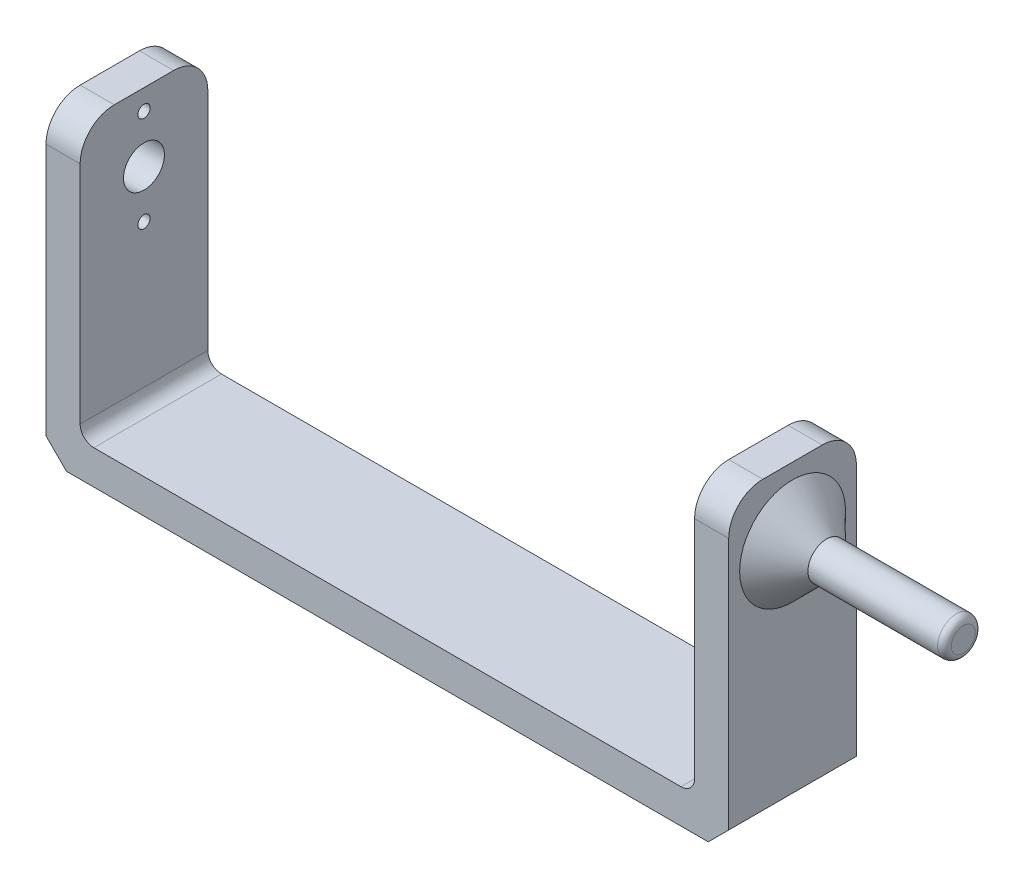
ISO-10303-21;
HEADER;
FILE_DESCRIPTION(('STEP AP214'),'2;1');
FILE_NAME('part.step','',(''),(''),'','','');
FILE_SCHEMA(('AUTOMOTIVE_DESIGN { 1 0 10303 214 1 1 1 1 }'));
ENDSEC;
DATA;
#1=APPLICATION_CONTEXT('core data for automotive mechanical design processes');
#2=APPLICATION_PROTOCOL_DEFINITION('international standard','automotive_design',2000,#1);
#3=PRODUCT_CONTEXT('',#1,'mechanical');
#4=PRODUCT('Part','Part','',(#3));
#5=PRODUCT_RELATED_PRODUCT_CATEGORY('part','',(#4));
#6=PRODUCT_DEFINITION_FORMATION('','',#4);
#7=PRODUCT_DEFINITION_CONTEXT('part definition',#1,'design');
#8=PRODUCT_DEFINITION('design','',#6,#7);
#9=PRODUCT_DEFINITION_SHAPE('','',#8);
#10=(LENGTH_UNIT() NAMED_UNIT(*) SI_UNIT(.MILLI.,.METRE.));
#11=(NAMED_UNIT(*) PLANE_ANGLE_UNIT() SI_UNIT($,.RADIAN.));
#12=(NAMED_UNIT(*) SI_UNIT($,.STERADIAN.) SOLID_ANGLE_UNIT());
#13=UNCERTAINTY_MEASURE_WITH_UNIT(LENGTH_MEASURE(1.E-05),#10,'distance_accuracy_value','');
#14=(GEOMETRIC_REPRESENTATION_CONTEXT(3) GLOBAL_UNCERTAINTY_ASSIGNED_CONTEXT((#13)) GLOBAL_UNIT_ASSIGNED_CONTEXT((#10,
#11,#12)) REPRESENTATION_CONTEXT('',''));
#15=CARTESIAN_POINT('',(0.,0.,0.));
#16=DIRECTION('',(0.,0.,1.));
#17=DIRECTION('',(1.,0.,0.));
#18=AXIS2_PLACEMENT_3D('',#15,#16,#17);
#19=CARTESIAN_POINT('',(50.,-16.0352422907489,18.7));
#20=DIRECTION('',(-1.,0.,0.));
#21=DIRECTION('',(0.,0.,1.));
#22=AXIS2_PLACEMENT_3D('',#19,#20,#21);
#23=PLANE('',#22);
#24=CARTESIAN_POINT('',(50.,13.9647577092511,9.35));
#25=DIRECTION('',(-1.,0.,0.));
#26=DIRECTION('',(0.,0.,1.));
#27=AXIS2_PLACEMENT_3D('',#24,#25,#26);
#28=CIRCLE('',#27,7.75000000000001);
#29=CARTESIAN_POINT('',(50.,13.9647577092511,17.1));
#30=VERTEX_POINT('',#29);
#31=EDGE_CURVE('E247',#30,#30,#28,.T.);
#32=ORIENTED_EDGE('',*,*,#31,.T.);
#33=EDGE_LOOP('',(#32));
#34=FACE_BOUND('',#33,.T.);
#35=DIRECTION('',(0.,1.,0.));
#36=VECTOR('',#35,1.);
#37=CARTESIAN_POINT('',(50.,-16.0352422907489,18.7));
#38=LINE('',#37,#36);
#39=CARTESIAN_POINT('',(50.,-18.0352422907489,18.7));
#40=VERTEX_POINT('',#39);
#41=CARTESIAN_POINT('',(50.,18.9647577092511,18.7));
#42=VERTEX_POINT('',#41);
#43=EDGE_CURVE('E342',#40,#42,#38,.T.);
#44=ORIENTED_EDGE('',*,*,#43,.F.);
#45=DIRECTION('',(0.,0.,-1.));
#46=VECTOR('',#45,1.);
#47=CARTESIAN_POINT('',(50.,-18.0352422907489,18.7));
#48=LINE('',#47,#46);
#49=CARTESIAN_POINT('',(50.,-18.0352422907489,0.));
#50=VERTEX_POINT('',#49);
#51=EDGE_CURVE('E231',#40,#50,#48,.T.);
#52=ORIENTED_EDGE('',*,*,#51,.T.);
#53=DIRECTION('',(0.,1.,0.));
#54=VECTOR('',#53,1.);
#55=CARTESIAN_POINT('',(50.,-16.0352422907489,0.));
#56=LINE('',#55,#54);
#57=CARTESIAN_POINT('',(50.,18.9647577092511,0.));
#58=VERTEX_POINT('',#57);
#59=EDGE_CURVE('E329',#50,#58,#56,.T.);
#60=ORIENTED_EDGE('',*,*,#59,.T.);
#61=CARTESIAN_POINT('',(50.,18.9647577092511,5.));
#62=DIRECTION('',(-1.,0.,0.));
#63=DIRECTION('',(0.,0.,1.));
#64=AXIS2_PLACEMENT_3D('',#61,#62,#63);
#65=CIRCLE('',#64,5.);
#66=CARTESIAN_POINT('',(50.,23.9647577092511,5.));
#67=VERTEX_POINT('',#66);
#68=EDGE_CURVE('E192',#58,#67,#65,.F.);
#69=ORIENTED_EDGE('',*,*,#68,.T.);
#70=DIRECTION('',(0.,0.,-1.));
#71=VECTOR('',#70,1.);
#72=CARTESIAN_POINT('',(50.,23.9647577092511,18.7));
#73=LINE('',#72,#71);
#74=CARTESIAN_POINT('',(50.,23.9647577092511,13.7));
#75=VERTEX_POINT('',#74);
#76=EDGE_CURVE('E173',#75,#67,#73,.T.);
#77=ORIENTED_EDGE('',*,*,#76,.F.);
#78=CARTESIAN_POINT('',(50.,18.9647577092511,13.7));
#79=DIRECTION('',(-1.,0.,0.));
#80=DIRECTION('',(0.,0.,1.));
#81=AXIS2_PLACEMENT_3D('',#78,#79,#80);
#82=CIRCLE('',#81,5.);
#83=EDGE_CURVE('E179',#75,#42,#82,.F.);
#84=ORIENTED_EDGE('',*,*,#83,.T.);
#85=EDGE_LOOP('',(#44,#52,#60,#69,#77,#84));
#86=FACE_BOUND('',#85,.T.);
#87=ADVANCED_FACE('F35',(#34,#86),#23,.F.);
#88=CARTESIAN_POINT('',(50.,23.9647577092511,18.7));
#89=DIRECTION('',(0.,-1.,0.));
#90=DIRECTION('',(0.,0.,-1.));
#91=AXIS2_PLACEMENT_3D('',#88,#89,#90);
#92=PLANE('',#91);
#93=ORIENTED_EDGE('',*,*,#76,.T.);
#94=DIRECTION('',(-1.,0.,0.));
#95=VECTOR('',#94,1.);
#96=CARTESIAN_POINT('',(50.,23.9647577092511,5.));
#97=LINE('',#96,#95);
#98=CARTESIAN_POINT('',(45.,23.9647577092511,5.));
#99=VERTEX_POINT('',#98);
#100=EDGE_CURVE('E164',#67,#99,#97,.T.);
#101=ORIENTED_EDGE('',*,*,#100,.T.);
#102=DIRECTION('',(0.,0.,-1.));
#103=VECTOR('',#102,1.);
#104=CARTESIAN_POINT('',(45.,23.9647577092511,18.7));
#105=LINE('',#104,#103);
#106=CARTESIAN_POINT('',(45.,23.9647577092511,13.7));
#107=VERTEX_POINT('',#106);
#108=EDGE_CURVE('E156',#107,#99,#105,.T.);
#109=ORIENTED_EDGE('',*,*,#108,.F.);
#110=DIRECTION('',(-1.,0.,0.));
#111=VECTOR('',#110,1.);
#112=CARTESIAN_POINT('',(50.,23.9647577092511,13.7));
#113=LINE('',#112,#111);
#114=EDGE_CURVE('E170',#107,#75,#113,.F.);
#115=ORIENTED_EDGE('',*,*,#114,.T.);
#116=EDGE_LOOP('',(#93,#101,#109,#115));
#117=FACE_BOUND('',#116,.T.);
#118=ADVANCED_FACE('F169',(#117),#92,.F.);
#119=CARTESIAN_POINT('',(45.,-16.0352422907489,18.7));
#120=DIRECTION('',(1.,0.,0.));
#121=DIRECTION('',(0.,0.,-1.));
#122=AXIS2_PLACEMENT_3D('',#119,#120,#121);
#123=PLANE('',#122);
#124=DIRECTION('',(0.,-1.,0.));
#125=VECTOR('',#124,1.);
#126=CARTESIAN_POINT('',(45.,-16.0352422907489,0.));
#127=LINE('',#126,#125);
#128=CARTESIAN_POINT('',(45.,18.9647577092511,0.));
#129=VERTEX_POINT('',#128);
#130=CARTESIAN_POINT('',(45.,-14.0352422907489,0.));
#131=VERTEX_POINT('',#130);
#132=EDGE_CURVE('E331',#129,#131,#127,.T.);
#133=ORIENTED_EDGE('',*,*,#132,.T.);
#134=DIRECTION('',(0.,0.,-1.));
#135=VECTOR('',#134,1.);
#136=CARTESIAN_POINT('',(45.,-14.0352422907489,18.7));
#137=LINE('',#136,#135);
#138=CARTESIAN_POINT('',(45.,-14.0352422907489,18.7));
#139=VERTEX_POINT('',#138);
#140=EDGE_CURVE('E218',#131,#139,#137,.F.);
#141=ORIENTED_EDGE('',*,*,#140,.T.);
#142=DIRECTION('',(0.,-1.,0.));
#143=VECTOR('',#142,1.);
#144=CARTESIAN_POINT('',(45.,-16.0352422907489,18.7));
#145=LINE('',#144,#143);
#146=CARTESIAN_POINT('',(45.,18.9647577092511,18.7));
#147=VERTEX_POINT('',#146);
#148=EDGE_CURVE('E158',#147,#139,#145,.T.);
#149=ORIENTED_EDGE('',*,*,#148,.F.);
#150=CARTESIAN_POINT('',(45.,18.9647577092511,13.7));
#151=DIRECTION('',(1.,0.,0.));
#152=DIRECTION('',(0.,0.,-1.));
#153=AXIS2_PLACEMENT_3D('',#150,#151,#152);
#154=CIRCLE('',#153,5.);
#155=EDGE_CURVE('E152',#147,#107,#154,.F.);
#156=ORIENTED_EDGE('',*,*,#155,.T.);
#157=ORIENTED_EDGE('',*,*,#108,.T.);
#158=CARTESIAN_POINT('',(45.,18.9647577092511,5.));
#159=DIRECTION('',(1.,0.,0.));
#160=DIRECTION('',(0.,0.,-1.));
#161=AXIS2_PLACEMENT_3D('',#158,#159,#160);
#162=CIRCLE('',#161,5.);
#163=EDGE_CURVE('E163',#99,#129,#162,.F.);
#164=ORIENTED_EDGE('',*,*,#163,.T.);
#165=EDGE_LOOP('',(#133,#141,#149,#156,#157,#164));
#166=FACE_BOUND('',#165,.T.);
#167=ADVANCED_FACE('F155',(#166),#123,.F.);
#168=CARTESIAN_POINT('',(-45.,-16.0352422907489,18.7));
#169=DIRECTION('',(0.,-1.,0.));
#170=DIRECTION('',(1.,0.,0.));
#171=AXIS2_PLACEMENT_3D('',#168,#169,#170);
#172=PLANE('',#171);
#173=DIRECTION('',(-1.,0.,0.));
#174=VECTOR('',#173,1.);
#175=CARTESIAN_POINT('',(-45.,-16.0352422907489,18.7));
#176=LINE('',#175,#174);
#177=CARTESIAN_POINT('',(43.,-16.0352422907489,18.7));
#178=VERTEX_POINT('',#177);
#179=CARTESIAN_POINT('',(-43.,-16.0352422907489,18.7));
#180=VERTEX_POINT('',#179);
#181=EDGE_CURVE('E363',#178,#180,#176,.T.);
#182=ORIENTED_EDGE('',*,*,#181,.F.);
#183=DIRECTION('',(0.,0.,-1.));
#184=VECTOR('',#183,1.);
#185=CARTESIAN_POINT('',(43.,-16.0352422907489,0.));
#186=LINE('',#185,#184);
#187=CARTESIAN_POINT('',(43.,-16.0352422907489,0.));
#188=VERTEX_POINT('',#187);
#189=EDGE_CURVE('E215',#178,#188,#186,.T.);
#190=ORIENTED_EDGE('',*,*,#189,.T.);
#191=DIRECTION('',(-1.,0.,0.));
#192=VECTOR('',#191,1.);
#193=CARTESIAN_POINT('',(-45.,-16.0352422907489,0.));
#194=LINE('',#193,#192);
#195=CARTESIAN_POINT('',(-43.,-16.0352422907489,0.));
#196=VERTEX_POINT('',#195);
#197=EDGE_CURVE('E334',#188,#196,#194,.T.);
#198=ORIENTED_EDGE('',*,*,#197,.T.);
#199=DIRECTION('',(0.,0.,-1.));
#200=VECTOR('',#199,1.);
#201=CARTESIAN_POINT('',(-43.,-16.0352422907489,18.7));
#202=LINE('',#201,#200);
#203=EDGE_CURVE('E213',#196,#180,#202,.F.);
#204=ORIENTED_EDGE('',*,*,#203,.T.);
#205=EDGE_LOOP('',(#182,#190,#198,#204));
#206=FACE_BOUND('',#205,.T.);
#207=ADVANCED_FACE('F375',(#206),#172,.F.);
#208=CARTESIAN_POINT('',(-45.,-16.0352422907489,18.7));
#209=DIRECTION('',(-1.,0.,0.));
#210=DIRECTION('',(0.,0.,1.));
#211=AXIS2_PLACEMENT_3D('',#208,#209,#210);
#212=PLANE('',#211);
#213=CARTESIAN_POINT('',(-45.,20.9647577092511,9.35));
#214=DIRECTION('',(-1.,0.,0.));
#215=DIRECTION('',(0.,0.,1.));
#216=AXIS2_PLACEMENT_3D('',#213,#214,#215);
#217=CIRCLE('',#216,0.900000000000004);
#218=CARTESIAN_POINT('',(-45.,20.9647577092511,10.25));
#219=VERTEX_POINT('',#218);
#220=EDGE_CURVE('E570',#219,#219,#217,.T.);
#221=ORIENTED_EDGE('',*,*,#220,.T.);
#222=EDGE_LOOP('',(#221));
#223=FACE_BOUND('',#222,.T.);
#224=CARTESIAN_POINT('',(-45.,6.96475770925109,9.35));
#225=DIRECTION('',(-1.,0.,0.));
#226=DIRECTION('',(0.,0.,1.));
#227=AXIS2_PLACEMENT_3D('',#224,#225,#226);
#228=CIRCLE('',#227,0.9);
#229=CARTESIAN_POINT('',(-45.,6.96475770925109,10.25));
#230=VERTEX_POINT('',#229);
#231=EDGE_CURVE('E572',#230,#230,#228,.T.);
#232=ORIENTED_EDGE('',*,*,#231,.T.);
#233=EDGE_LOOP('',(#232));
#234=FACE_BOUND('',#233,.T.);
#235=CARTESIAN_POINT('',(-45.,13.9647577092511,9.35));
#236=DIRECTION('',(-1.,0.,0.));
#237=DIRECTION('',(0.,0.,1.));
#238=AXIS2_PLACEMENT_3D('',#235,#236,#237);
#239=CIRCLE('',#238,3.);
#240=CARTESIAN_POINT('',(-45.,13.9647577092511,12.35));
#241=VERTEX_POINT('',#240);
#242=EDGE_CURVE('E332',#241,#241,#239,.T.);
#243=ORIENTED_EDGE('',*,*,#242,.T.);
#244=EDGE_LOOP('',(#243));
#245=FACE_BOUND('',#244,.T.);
#246=DIRECTION('',(0.,1.,0.));
#247=VECTOR('',#246,1.);
#248=CARTESIAN_POINT('',(-45.,-16.0352422907489,18.7));
#249=LINE('',#248,#247);
#250=CARTESIAN_POINT('',(-45.,-14.0352422907489,18.7));
#251=VERTEX_POINT('',#250);
#252=CARTESIAN_POINT('',(-45.,18.9647577092511,18.7));
#253=VERTEX_POINT('',#252);
#254=EDGE_CURVE('E325',#251,#253,#249,.T.);
#255=ORIENTED_EDGE('',*,*,#254,.F.);
#256=DIRECTION('',(0.,0.,-1.));
#257=VECTOR('',#256,1.);
#258=CARTESIAN_POINT('',(-45.,-14.0352422907489,0.));
#259=LINE('',#258,#257);
#260=CARTESIAN_POINT('',(-45.,-14.0352422907489,0.));
#261=VERTEX_POINT('',#260);
#262=EDGE_CURVE('E220',#251,#261,#259,.T.);
#263=ORIENTED_EDGE('',*,*,#262,.T.);
#264=DIRECTION('',(0.,1.,0.));
#265=VECTOR('',#264,1.);
#266=CARTESIAN_POINT('',(-45.,-16.0352422907489,0.));
#267=LINE('',#266,#265);
#268=CARTESIAN_POINT('',(-45.,18.9647577092511,0.));
#269=VERTEX_POINT('',#268);
#270=EDGE_CURVE('E337',#261,#269,#267,.T.);
#271=ORIENTED_EDGE('',*,*,#270,.T.);
#272=CARTESIAN_POINT('',(-45.,18.9647577092511,5.));
#273=DIRECTION('',(-1.,0.,0.));
#274=DIRECTION('',(0.,0.,1.));
#275=AXIS2_PLACEMENT_3D('',#272,#273,#274);
#276=CIRCLE('',#275,5.);
#277=CARTESIAN_POINT('',(-45.,23.9647577092511,5.));
#278=VERTEX_POINT('',#277);
#279=EDGE_CURVE('E208',#269,#278,#276,.F.);
#280=ORIENTED_EDGE('',*,*,#279,.T.);
#281=DIRECTION('',(0.,0.,-1.));
#282=VECTOR('',#281,1.);
#283=CARTESIAN_POINT('',(-45.,23.9647577092511,18.7));
#284=LINE('',#283,#282);
#285=CARTESIAN_POINT('',(-45.,23.9647577092511,13.7));
#286=VERTEX_POINT('',#285);
#287=EDGE_CURVE('E174',#286,#278,#284,.T.);
#288=ORIENTED_EDGE('',*,*,#287,.F.);
#289=CARTESIAN_POINT('',(-45.,18.9647577092511,13.7));
#290=DIRECTION('',(-1.,0.,0.));
#291=DIRECTION('',(0.,0.,1.));
#292=AXIS2_PLACEMENT_3D('',#289,#290,#291);
#293=CIRCLE('',#292,5.);
#294=EDGE_CURVE('E210',#286,#253,#293,.F.);
#295=ORIENTED_EDGE('',*,*,#294,.T.);
#296=EDGE_LOOP('',(#255,#263,#271,#280,#288,#295));
#297=FACE_BOUND('',#296,.T.);
#298=ADVANCED_FACE('F373',(#223,#234,#245,#297),#212,.F.);
#299=CARTESIAN_POINT('',(-50.,23.9647577092511,18.7));
#300=DIRECTION('',(0.,-1.,0.));
#301=DIRECTION('',(0.,0.,-1.));
#302=AXIS2_PLACEMENT_3D('',#299,#300,#301);
#303=PLANE('',#302);
#304=DIRECTION('',(0.,0.,-1.));
#305=VECTOR('',#304,1.);
#306=CARTESIAN_POINT('',(-50.,23.9647577092511,18.7));
#307=LINE('',#306,#305);
#308=CARTESIAN_POINT('',(-50.,23.9647577092511,13.7));
#309=VERTEX_POINT('',#308);
#310=CARTESIAN_POINT('',(-50.,23.9647577092511,5.));
#311=VERTEX_POINT('',#310);
#312=EDGE_CURVE('E321',#309,#311,#307,.T.);
#313=ORIENTED_EDGE('',*,*,#312,.F.);
#314=DIRECTION('',(-1.,0.,0.));
#315=VECTOR('',#314,1.);
#316=CARTESIAN_POINT('',(-45.,23.9647577092511,13.7));
#317=LINE('',#316,#315);
#318=EDGE_CURVE('E206',#309,#286,#317,.F.);
#319=ORIENTED_EDGE('',*,*,#318,.T.);
#320=ORIENTED_EDGE('',*,*,#287,.T.);
#321=DIRECTION('',(-1.,0.,0.));
#322=VECTOR('',#321,1.);
#323=CARTESIAN_POINT('',(-50.,23.9647577092511,5.));
#324=LINE('',#323,#322);
#325=EDGE_CURVE('E203',#278,#311,#324,.T.);
#326=ORIENTED_EDGE('',*,*,#325,.T.);
#327=EDGE_LOOP('',(#313,#319,#320,#326));
#328=FACE_BOUND('',#327,.T.);
#329=ADVANCED_FACE('F349',(#328),#303,.F.);
#330=CARTESIAN_POINT('',(-50.,-16.0352422907489,18.7));
#331=DIRECTION('',(1.,0.,0.));
#332=DIRECTION('',(0.,0.,-1.));
#333=AXIS2_PLACEMENT_3D('',#330,#331,#332);
#334=PLANE('',#333);
#335=CARTESIAN_POINT('',(-50.,20.9647577092511,9.35));
#336=DIRECTION('',(-1.,0.,0.));
#337=DIRECTION('',(0.,0.,1.));
#338=AXIS2_PLACEMENT_3D('',#335,#336,#337);
#339=CIRCLE('',#338,0.900000000000004);
#340=CARTESIAN_POINT('',(-50.,20.9647577092511,10.25));
#341=VERTEX_POINT('',#340);
#342=EDGE_CURVE('E568',#341,#341,#339,.T.);
#343=ORIENTED_EDGE('',*,*,#342,.F.);
#344=EDGE_LOOP('',(#343));
#345=FACE_BOUND('',#344,.T.);
#346=CARTESIAN_POINT('',(-50.,6.96475770925109,9.35));
#347=DIRECTION('',(-1.,0.,0.));
#348=DIRECTION('',(0.,0.,1.));
#349=AXIS2_PLACEMENT_3D('',#346,#347,#348);
#350=CIRCLE('',#349,0.9);
#351=CARTESIAN_POINT('',(-50.,6.96475770925109,10.25));
#352=VERTEX_POINT('',#351);
#353=EDGE_CURVE('E578',#352,#352,#350,.T.);
#354=ORIENTED_EDGE('',*,*,#353,.F.);
#355=EDGE_LOOP('',(#354));
#356=FACE_BOUND('',#355,.T.);
#357=CARTESIAN_POINT('',(-50.,13.9647577092511,9.35));
#358=DIRECTION('',(-1.,0.,0.));
#359=DIRECTION('',(0.,0.,1.));
#360=AXIS2_PLACEMENT_3D('',#357,#358,#359);
#361=CIRCLE('',#360,3.);
#362=CARTESIAN_POINT('',(-50.,13.9647577092511,12.35));
#363=VERTEX_POINT('',#362);
#364=EDGE_CURVE('E571',#363,#363,#361,.T.);
#365=ORIENTED_EDGE('',*,*,#364,.F.);
#366=EDGE_LOOP('',(#365));
#367=FACE_BOUND('',#366,.T.);
#368=DIRECTION('',(0.,-1.,0.));
#369=VECTOR('',#368,1.);
#370=CARTESIAN_POINT('',(-50.,-16.0352422907489,0.));
#371=LINE('',#370,#369);
#372=CARTESIAN_POINT('',(-50.,18.9647577092511,0.));
#373=VERTEX_POINT('',#372);
#374=CARTESIAN_POINT('',(-50.,-18.0352422907489,0.));
#375=VERTEX_POINT('',#374);
#376=EDGE_CURVE('E339',#373,#375,#371,.T.);
#377=ORIENTED_EDGE('',*,*,#376,.T.);
#378=DIRECTION('',(0.,0.,1.));
#379=VECTOR('',#378,1.);
#380=CARTESIAN_POINT('',(-50.,-18.0352422907489,18.7));
#381=LINE('',#380,#379);
#382=CARTESIAN_POINT('',(-50.,-18.0352422907489,18.7));
#383=VERTEX_POINT('',#382);
#384=EDGE_CURVE('E50',#375,#383,#381,.T.);
#385=ORIENTED_EDGE('',*,*,#384,.T.);
#386=DIRECTION('',(0.,-1.,0.));
#387=VECTOR('',#386,1.);
#388=CARTESIAN_POINT('',(-50.,-16.0352422907489,18.7));
#389=LINE('',#388,#387);
#390=CARTESIAN_POINT('',(-50.,18.9647577092511,18.7));
#391=VERTEX_POINT('',#390);
#392=EDGE_CURVE('E318',#391,#383,#389,.T.);
#393=ORIENTED_EDGE('',*,*,#392,.F.);
#394=CARTESIAN_POINT('',(-50.,18.9647577092511,13.7));
#395=DIRECTION('',(1.,0.,0.));
#396=DIRECTION('',(0.,0.,-1.));
#397=AXIS2_PLACEMENT_3D('',#394,#395,#396);
#398=CIRCLE('',#397,5.);
#399=EDGE_CURVE('E201',#391,#309,#398,.F.);
#400=ORIENTED_EDGE('',*,*,#399,.T.);
#401=ORIENTED_EDGE('',*,*,#312,.T.);
#402=CARTESIAN_POINT('',(-50.,18.9647577092511,5.));
#403=DIRECTION('',(1.,0.,0.));
#404=DIRECTION('',(0.,0.,-1.));
#405=AXIS2_PLACEMENT_3D('',#402,#403,#404);
#406=CIRCLE('',#405,5.);
#407=EDGE_CURVE('E199',#311,#373,#406,.F.);
#408=ORIENTED_EDGE('',*,*,#407,.T.);
#409=EDGE_LOOP('',(#377,#385,#393,#400,#401,#408));
#410=FACE_BOUND('',#409,.T.);
#411=ADVANCED_FACE('F356',(#345,#356,#367,#410),#334,.F.);
#412=CARTESIAN_POINT('',(-50.,-21.0352422907489,18.7));
#413=DIRECTION('',(0.,1.,0.));
#414=DIRECTION('',(0.,0.,1.));
#415=AXIS2_PLACEMENT_3D('',#412,#413,#414);
#416=PLANE('',#415);
#417=DIRECTION('',(1.,0.,0.));
#418=VECTOR('',#417,1.);
#419=CARTESIAN_POINT('',(-50.,-21.0352422907489,0.));
#420=LINE('',#419,#418);
#421=CARTESIAN_POINT('',(-47.,-21.0352422907489,0.));
#422=VERTEX_POINT('',#421);
#423=CARTESIAN_POINT('',(47.,-21.0352422907489,0.));
#424=VERTEX_POINT('',#423);
#425=EDGE_CURVE('E341',#422,#424,#420,.T.);
#426=ORIENTED_EDGE('',*,*,#425,.T.);
#427=DIRECTION('',(0.,0.,1.));
#428=VECTOR('',#427,1.);
#429=CARTESIAN_POINT('',(47.,-21.0352422907489,18.7));
#430=LINE('',#429,#428);
#431=CARTESIAN_POINT('',(47.,-21.0352422907489,18.7));
#432=VERTEX_POINT('',#431);
#433=EDGE_CURVE('E58',#424,#432,#430,.T.);
#434=ORIENTED_EDGE('',*,*,#433,.T.);
#435=DIRECTION('',(1.,0.,0.));
#436=VECTOR('',#435,1.);
#437=CARTESIAN_POINT('',(-50.,-21.0352422907489,18.7));
#438=LINE('',#437,#436);
#439=CARTESIAN_POINT('',(-47.,-21.0352422907489,18.7));
#440=VERTEX_POINT('',#439);
#441=EDGE_CURVE('E316',#440,#432,#438,.T.);
#442=ORIENTED_EDGE('',*,*,#441,.F.);
#443=DIRECTION('',(0.,0.,-1.));
#444=VECTOR('',#443,1.);
#445=CARTESIAN_POINT('',(-47.,-21.0352422907489,18.7));
#446=LINE('',#445,#444);
#447=EDGE_CURVE('E238',#440,#422,#446,.T.);
#448=ORIENTED_EDGE('',*,*,#447,.T.);
#449=EDGE_LOOP('',(#426,#434,#442,#448));
#450=FACE_BOUND('',#449,.T.);
#451=ADVANCED_FACE('F319',(#450),#416,.F.);
#452=CARTESIAN_POINT('',(0.,0.,18.7));
#453=DIRECTION('',(0.,0.,1.));
#454=DIRECTION('',(1.,0.,0.));
#455=AXIS2_PLACEMENT_3D('',#452,#453,#454);
#456=PLANE('',#455);
#457=ORIENTED_EDGE('',*,*,#441,.T.);
#458=DIRECTION('',(-0.707106781186549,-0.707106781186546,0.));
#459=VECTOR('',#458,1.);
#460=CARTESIAN_POINT('',(34.0176211453743,-34.0176211453745,18.7));
#461=LINE('',#460,#459);
#462=EDGE_CURVE('E244',#432,#40,#461,.F.);
#463=ORIENTED_EDGE('',*,*,#462,.T.);
#464=ORIENTED_EDGE('',*,*,#43,.T.);
#465=DIRECTION('',(-1.,0.,0.));
#466=VECTOR('',#465,1.);
#467=CARTESIAN_POINT('',(45.,18.9647577092511,18.7));
#468=LINE('',#467,#466);
#469=EDGE_CURVE('E197',#42,#147,#468,.T.);
#470=ORIENTED_EDGE('',*,*,#469,.T.);
#471=ORIENTED_EDGE('',*,*,#148,.T.);
#472=CARTESIAN_POINT('',(43.,-14.0352422907489,18.7));
#473=DIRECTION('',(0.,0.,1.));
#474=DIRECTION('',(1.,0.,0.));
#475=AXIS2_PLACEMENT_3D('',#472,#473,#474);
#476=CIRCLE('',#475,2.);
#477=EDGE_CURVE('E225',#139,#178,#476,.F.);
#478=ORIENTED_EDGE('',*,*,#477,.T.);
#479=ORIENTED_EDGE('',*,*,#181,.T.);
#480=CARTESIAN_POINT('',(-43.,-14.0352422907489,18.7));
#481=DIRECTION('',(0.,0.,1.));
#482=DIRECTION('',(1.,0.,0.));
#483=AXIS2_PLACEMENT_3D('',#480,#481,#482);
#484=CIRCLE('',#483,2.);
#485=EDGE_CURVE('E229',#180,#251,#484,.F.);
#486=ORIENTED_EDGE('',*,*,#485,.T.);
#487=ORIENTED_EDGE('',*,*,#254,.T.);
#488=DIRECTION('',(-1.,0.,0.));
#489=VECTOR('',#488,1.);
#490=CARTESIAN_POINT('',(-50.,18.9647577092511,18.7));
#491=LINE('',#490,#489);
#492=EDGE_CURVE('E194',#253,#391,#491,.T.);
#493=ORIENTED_EDGE('',*,*,#492,.T.);
#494=ORIENTED_EDGE('',*,*,#392,.T.);
#495=DIRECTION('',(-0.707106781186546,0.707106781186549,0.));
#496=VECTOR('',#495,1.);
#497=CARTESIAN_POINT('',(-34.0176211453746,-34.0176211453744,18.7));
#498=LINE('',#497,#496);
#499=EDGE_CURVE('E242',#383,#440,#498,.F.);
#500=ORIENTED_EDGE('',*,*,#499,.T.);
#501=EDGE_LOOP('',(#457,#463,#464,#470,#471,#478,#479,#486,#487,#493,#494,#500));
#502=FACE_BOUND('',#501,.T.);
#503=ADVANCED_FACE('F315',(#502),#456,.T.);
#504=CARTESIAN_POINT('',(0.,0.,0.));
#505=DIRECTION('',(0.,0.,1.));
#506=DIRECTION('',(1.,0.,0.));
#507=AXIS2_PLACEMENT_3D('',#504,#505,#506);
#508=PLANE('',#507);
#509=ORIENTED_EDGE('',*,*,#59,.F.);
#510=DIRECTION('',(0.707106781186549,0.707106781186546,0.));
#511=VECTOR('',#510,1.);
#512=CARTESIAN_POINT('',(50.,-18.0352422907489,0.));
#513=LINE('',#512,#511);
#514=EDGE_CURVE('E236',#50,#424,#513,.F.);
#515=ORIENTED_EDGE('',*,*,#514,.T.);
#516=ORIENTED_EDGE('',*,*,#425,.F.);
#517=DIRECTION('',(0.707106781186546,-0.707106781186549,0.));
#518=VECTOR('',#517,1.);
#519=CARTESIAN_POINT('',(-47.,-21.0352422907489,0.));
#520=LINE('',#519,#518);
#521=EDGE_CURVE('E234',#422,#375,#520,.F.);
#522=ORIENTED_EDGE('',*,*,#521,.T.);
#523=ORIENTED_EDGE('',*,*,#376,.F.);
#524=DIRECTION('',(-1.,0.,0.));
#525=VECTOR('',#524,1.);
#526=CARTESIAN_POINT('',(0.,18.9647577092511,0.));
#527=LINE('',#526,#525);
#528=EDGE_CURVE('E185',#373,#269,#527,.F.);
#529=ORIENTED_EDGE('',*,*,#528,.T.);
#530=ORIENTED_EDGE('',*,*,#270,.F.);
#531=CARTESIAN_POINT('',(-43.,-14.0352422907489,0.));
#532=DIRECTION('',(0.,0.,1.));
#533=DIRECTION('',(1.,0.,0.));
#534=AXIS2_PLACEMENT_3D('',#531,#532,#533);
#535=CIRCLE('',#534,2.);
#536=EDGE_CURVE('E227',#261,#196,#535,.T.);
#537=ORIENTED_EDGE('',*,*,#536,.T.);
#538=ORIENTED_EDGE('',*,*,#197,.F.);
#539=CARTESIAN_POINT('',(43.,-14.0352422907489,0.));
#540=DIRECTION('',(0.,0.,1.));
#541=DIRECTION('',(1.,0.,0.));
#542=AXIS2_PLACEMENT_3D('',#539,#540,#541);
#543=CIRCLE('',#542,2.);
#544=EDGE_CURVE('E223',#188,#131,#543,.T.);
#545=ORIENTED_EDGE('',*,*,#544,.T.);
#546=ORIENTED_EDGE('',*,*,#132,.F.);
#547=DIRECTION('',(-1.,0.,0.));
#548=VECTOR('',#547,1.);
#549=CARTESIAN_POINT('',(0.,18.9647577092511,0.));
#550=LINE('',#549,#548);
#551=EDGE_CURVE('E188',#129,#58,#550,.F.);
#552=ORIENTED_EDGE('',*,*,#551,.T.);
#553=EDGE_LOOP('',(#509,#515,#516,#522,#523,#529,#530,#537,#538,#545,#546,#552));
#554=FACE_BOUND('',#553,.T.);
#555=ADVANCED_FACE('F278',(#554),#508,.F.);
#556=CARTESIAN_POINT('',(50.,18.9647577092511,5.));
#557=DIRECTION('',(-1.,0.,0.));
#558=DIRECTION('',(0.,0.,1.));
#559=AXIS2_PLACEMENT_3D('',#556,#557,#558);
#560=CYLINDRICAL_SURFACE('',#559,5.);
#561=ORIENTED_EDGE('',*,*,#68,.F.);
#562=ORIENTED_EDGE('',*,*,#551,.F.);
#563=ORIENTED_EDGE('',*,*,#163,.F.);
#564=ORIENTED_EDGE('',*,*,#100,.F.);
#565=EDGE_LOOP('',(#561,#562,#563,#564));
#566=FACE_BOUND('',#565,.T.);
#567=ADVANCED_FACE('F275',(#566),#560,.T.);
#568=CARTESIAN_POINT('',(0.,18.9647577092511,13.7));
#569=DIRECTION('',(1.,0.,0.));
#570=DIRECTION('',(0.,0.,-1.));
#571=AXIS2_PLACEMENT_3D('',#568,#569,#570);
#572=CYLINDRICAL_SURFACE('',#571,5.);
#573=ORIENTED_EDGE('',*,*,#83,.F.);
#574=ORIENTED_EDGE('',*,*,#114,.F.);
#575=ORIENTED_EDGE('',*,*,#155,.F.);
#576=ORIENTED_EDGE('',*,*,#469,.F.);
#577=EDGE_LOOP('',(#573,#574,#575,#576));
#578=FACE_BOUND('',#577,.T.);
#579=ADVANCED_FACE('F177',(#578),#572,.T.);
#580=CARTESIAN_POINT('',(0.,18.9647577092511,13.7));
#581=DIRECTION('',(1.,0.,0.));
#582=DIRECTION('',(0.,0.,-1.));
#583=AXIS2_PLACEMENT_3D('',#580,#581,#582);
#584=CYLINDRICAL_SURFACE('',#583,5.);
#585=ORIENTED_EDGE('',*,*,#294,.F.);
#586=ORIENTED_EDGE('',*,*,#318,.F.);
#587=ORIENTED_EDGE('',*,*,#399,.F.);
#588=ORIENTED_EDGE('',*,*,#492,.F.);
#589=EDGE_LOOP('',(#585,#586,#587,#588));
#590=FACE_BOUND('',#589,.T.);
#591=ADVANCED_FACE('F282',(#590),#584,.T.);
#592=CARTESIAN_POINT('',(-50.,18.9647577092511,5.));
#593=DIRECTION('',(-1.,0.,0.));
#594=DIRECTION('',(0.,0.,1.));
#595=AXIS2_PLACEMENT_3D('',#592,#593,#594);
#596=CYLINDRICAL_SURFACE('',#595,5.);
#597=ORIENTED_EDGE('',*,*,#279,.F.);
#598=ORIENTED_EDGE('',*,*,#528,.F.);
#599=ORIENTED_EDGE('',*,*,#407,.F.);
#600=ORIENTED_EDGE('',*,*,#325,.F.);
#601=EDGE_LOOP('',(#597,#598,#599,#600));
#602=FACE_BOUND('',#601,.T.);
#603=ADVANCED_FACE('F285',(#602),#596,.T.);
#604=CARTESIAN_POINT('',(43.,-14.0352422907489,18.7));
#605=DIRECTION('',(0.,0.,1.));
#606=DIRECTION('',(1.,0.,0.));
#607=AXIS2_PLACEMENT_3D('',#604,#605,#606);
#608=CYLINDRICAL_SURFACE('',#607,2.);
#609=ORIENTED_EDGE('',*,*,#477,.F.);
#610=ORIENTED_EDGE('',*,*,#140,.F.);
#611=ORIENTED_EDGE('',*,*,#544,.F.);
#612=ORIENTED_EDGE('',*,*,#189,.F.);
#613=EDGE_LOOP('',(#609,#610,#611,#612));
#614=FACE_BOUND('',#613,.T.);
#615=ADVANCED_FACE('F289',(#614),#608,.F.);
#616=CARTESIAN_POINT('',(-43.,-14.0352422907489,18.7));
#617=DIRECTION('',(0.,0.,1.));
#618=DIRECTION('',(1.,0.,0.));
#619=AXIS2_PLACEMENT_3D('',#616,#617,#618);
#620=CYLINDRICAL_SURFACE('',#619,2.);
#621=ORIENTED_EDGE('',*,*,#485,.F.);
#622=ORIENTED_EDGE('',*,*,#203,.F.);
#623=ORIENTED_EDGE('',*,*,#536,.F.);
#624=ORIENTED_EDGE('',*,*,#262,.F.);
#625=EDGE_LOOP('',(#621,#622,#623,#624));
#626=FACE_BOUND('',#625,.T.);
#627=ADVANCED_FACE('F293',(#626),#620,.F.);
#628=CARTESIAN_POINT('',(50.,-18.0352422907489,18.7));
#629=DIRECTION('',(-0.707106781186546,0.707106781186549,0.));
#630=DIRECTION('',(0.,0.,-1.));
#631=AXIS2_PLACEMENT_3D('',#628,#629,#630);
#632=PLANE('',#631);
#633=ORIENTED_EDGE('',*,*,#462,.F.);
#634=ORIENTED_EDGE('',*,*,#433,.F.);
#635=ORIENTED_EDGE('',*,*,#514,.F.);
#636=ORIENTED_EDGE('',*,*,#51,.F.);
#637=EDGE_LOOP('',(#633,#634,#635,#636));
#638=FACE_BOUND('',#637,.T.);
#639=ADVANCED_FACE('F297',(#638),#632,.F.);
#640=CARTESIAN_POINT('',(-47.,-21.0352422907489,18.7));
#641=DIRECTION('',(0.707106781186549,0.707106781186546,0.));
#642=DIRECTION('',(0.,0.,-1.));
#643=AXIS2_PLACEMENT_3D('',#640,#641,#642);
#644=PLANE('',#643);
#645=ORIENTED_EDGE('',*,*,#499,.F.);
#646=ORIENTED_EDGE('',*,*,#384,.F.);
#647=ORIENTED_EDGE('',*,*,#521,.F.);
#648=ORIENTED_EDGE('',*,*,#447,.F.);
#649=EDGE_LOOP('',(#645,#646,#647,#648));
#650=FACE_BOUND('',#649,.T.);
#651=ADVANCED_FACE('F301',(#650),#644,.F.);
#652=CARTESIAN_POINT('',(-31.3,13.9647577092511,9.35));
#653=DIRECTION('',(-1.,0.,0.));
#654=DIRECTION('',(0.,0.,1.));
#655=AXIS2_PLACEMENT_3D('',#652,#653,#654);
#656=CYLINDRICAL_SURFACE('',#655,3.);
#657=ORIENTED_EDGE('',*,*,#364,.T.);
#658=EDGE_LOOP('',(#657));
#659=FACE_BOUND('',#658,.T.);
#660=ORIENTED_EDGE('',*,*,#242,.F.);
#661=EDGE_LOOP('',(#660));
#662=FACE_BOUND('',#661,.T.);
#663=ADVANCED_FACE('F304',(#659,#662),#656,.F.);
#664=CARTESIAN_POINT('',(-31.3,6.96475770925109,9.35));
#665=DIRECTION('',(-1.,0.,0.));
#666=DIRECTION('',(0.,0.,1.));
#667=AXIS2_PLACEMENT_3D('',#664,#665,#666);
#668=CYLINDRICAL_SURFACE('',#667,0.9);
#669=ORIENTED_EDGE('',*,*,#353,.T.);
#670=EDGE_LOOP('',(#669));
#671=FACE_BOUND('',#670,.T.);
#672=ORIENTED_EDGE('',*,*,#231,.F.);
#673=EDGE_LOOP('',(#672));
#674=FACE_BOUND('',#673,.T.);
#675=ADVANCED_FACE('F309',(#671,#674),#668,.F.);
#676=CARTESIAN_POINT('',(-31.3,20.9647577092511,9.35));
#677=DIRECTION('',(-1.,0.,0.));
#678=DIRECTION('',(0.,0.,1.));
#679=AXIS2_PLACEMENT_3D('',#676,#677,#678);
#680=CYLINDRICAL_SURFACE('',#679,0.900000000000004);
#681=ORIENTED_EDGE('',*,*,#342,.T.);
#682=EDGE_LOOP('',(#681));
#683=FACE_BOUND('',#682,.T.);
#684=ORIENTED_EDGE('',*,*,#220,.F.);
#685=EDGE_LOOP('',(#684));
#686=FACE_BOUND('',#685,.T.);
#687=ADVANCED_FACE('F478',(#683,#686),#680,.F.);
#688=CARTESIAN_POINT('',(45.,13.9647577092511,9.35));
#689=DIRECTION('',(1.,0.,0.));
#690=DIRECTION('',(0.,0.,-1.));
#691=AXIS2_PLACEMENT_3D('',#688,#689,#690);
#692=CYLINDRICAL_SURFACE('',#691,2.75);
#693=CARTESIAN_POINT('',(74.,13.9647577092511,9.35));
#694=DIRECTION('',(1.,0.,0.));
#695=DIRECTION('',(0.,0.,-1.));
#696=AXIS2_PLACEMENT_3D('',#693,#694,#695);
#697=CIRCLE('',#696,2.75);
#698=CARTESIAN_POINT('',(74.,13.9647577092511,6.6));
#699=VERTEX_POINT('',#698);
#700=EDGE_CURVE('E11',#699,#699,#697,.F.);
#701=ORIENTED_EDGE('',*,*,#700,.T.);
#702=EDGE_LOOP('',(#701));
#703=FACE_BOUND('',#702,.T.);
#704=CARTESIAN_POINT('',(55.,13.9647577092511,9.35));
#705=DIRECTION('',(-1.,0.,0.));
#706=DIRECTION('',(0.,0.,1.));
#707=AXIS2_PLACEMENT_3D('',#704,#705,#706);
#708=CIRCLE('',#707,2.75);
#709=CARTESIAN_POINT('',(55.,13.9647577092511,12.1));
#710=VERTEX_POINT('',#709);
#711=EDGE_CURVE('E250',#710,#710,#708,.F.);
#712=ORIENTED_EDGE('',*,*,#711,.T.);
#713=EDGE_LOOP('',(#712));
#714=FACE_BOUND('',#713,.T.);
#715=ADVANCED_FACE('F487',(#703,#714),#692,.T.);
#716=CARTESIAN_POINT('',(75.,13.9647577092511,9.35));
#717=DIRECTION('',(1.,0.,0.));
#718=DIRECTION('',(0.,0.,-1.));
#719=AXIS2_PLACEMENT_3D('',#716,#717,#718);
#720=PLANE('',#719);
#721=CARTESIAN_POINT('',(75.,13.9647577092511,9.35));
#722=DIRECTION('',(1.,0.,0.));
#723=DIRECTION('',(0.,0.,-1.));
#724=AXIS2_PLACEMENT_3D('',#721,#722,#723);
#725=CIRCLE('',#724,1.75);
#726=CARTESIAN_POINT('',(75.,13.9647577092511,7.6));
#727=VERTEX_POINT('',#726);
#728=EDGE_CURVE('E43',#727,#727,#725,.T.);
#729=ORIENTED_EDGE('',*,*,#728,.T.);
#730=EDGE_LOOP('',(#729));
#731=FACE_BOUND('',#730,.T.);
#732=ADVANCED_FACE('F255',(#731),#720,.T.);
#733=CARTESIAN_POINT('',(50.,13.9647577092511,9.35));
#734=DIRECTION('',(-1.,0.,0.));
#735=DIRECTION('',(0.,0.,1.));
#736=AXIS2_PLACEMENT_3D('',#733,#734,#735);
#737=CONICAL_SURFACE('',#736,7.75000000000001,0.785398163397454);
#738=ORIENTED_EDGE('',*,*,#711,.F.);
#739=EDGE_LOOP('',(#738));
#740=FACE_BOUND('',#739,.T.);
#741=ORIENTED_EDGE('',*,*,#31,.F.);
#742=EDGE_LOOP('',(#741));
#743=FACE_BOUND('',#742,.T.);
#744=ADVANCED_FACE('F258',(#740,#743),#737,.T.);
#745=CARTESIAN_POINT('',(74.,13.9647577092511,9.35));
#746=DIRECTION('',(1.,0.,0.));
#747=DIRECTION('',(0.,0.,-1.));
#748=AXIS2_PLACEMENT_3D('',#745,#746,#747);
#749=TOROIDAL_SURFACE('',#748,1.75,1.);
#750=ORIENTED_EDGE('',*,*,#700,.F.);
#751=EDGE_LOOP('',(#750));
#752=FACE_BOUND('',#751,.T.);
#753=ORIENTED_EDGE('',*,*,#728,.F.);
#754=EDGE_LOOP('',(#753));
#755=FACE_BOUND('',#754,.T.);
#756=ADVANCED_FACE('F37',(#752,#755),#749,.T.);
#757=CLOSED_SHELL('',(#87,#118,#167,#207,#298,#329,#411,#451,#503,#555,#567,#579,#591,#603,#615,
#627,#639,#651,#663,#675,#687,#715,#732,#744,#756));
#758=MANIFOLD_SOLID_BREP('B2',#757);
#759=ADVANCED_BREP_SHAPE_REPRESENTATION('',(#18,#758),#14);
#760=SHAPE_DEFINITION_REPRESENTATION(#9,#759);
ENDSEC;
END-ISO-10303-21;
